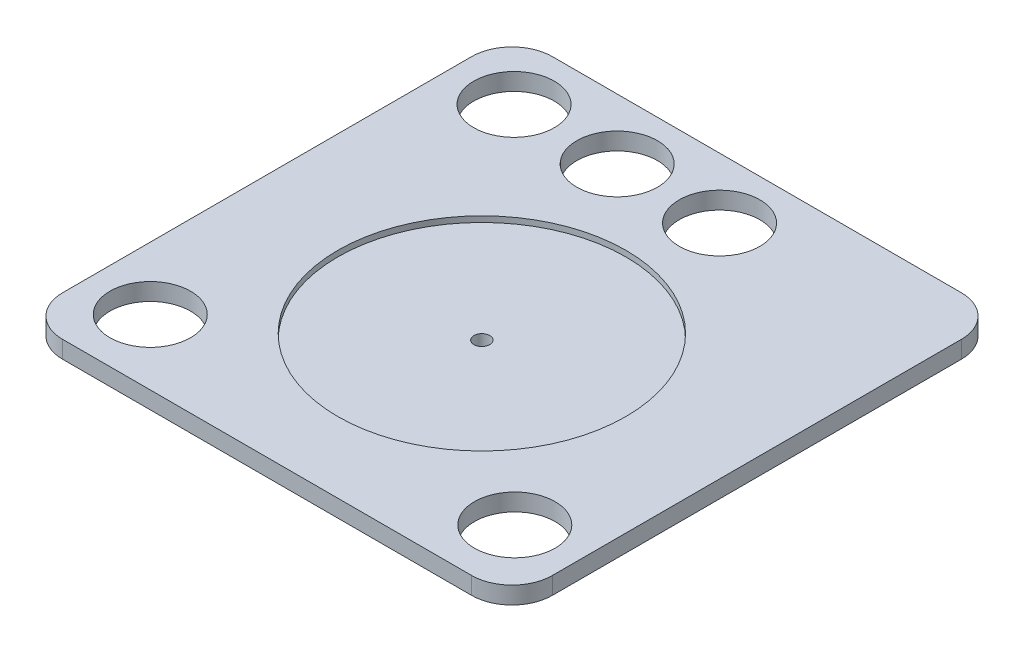
ISO-10303-21;
HEADER;
FILE_DESCRIPTION(('STEP AP214'),'2;1');
FILE_NAME('part.step','',(''),(''),'','','');
FILE_SCHEMA(('AUTOMOTIVE_DESIGN { 1 0 10303 214 1 1 1 1 }'));
ENDSEC;
DATA;
#1=APPLICATION_CONTEXT('core data for automotive mechanical design processes');
#2=APPLICATION_PROTOCOL_DEFINITION('international standard','automotive_design',2000,#1);
#3=PRODUCT_CONTEXT('',#1,'mechanical');
#4=PRODUCT('Part','Part','',(#3));
#5=PRODUCT_RELATED_PRODUCT_CATEGORY('part','',(#4));
#6=PRODUCT_DEFINITION_FORMATION('','',#4);
#7=PRODUCT_DEFINITION_CONTEXT('part definition',#1,'design');
#8=PRODUCT_DEFINITION('design','',#6,#7);
#9=PRODUCT_DEFINITION_SHAPE('','',#8);
#10=(LENGTH_UNIT() NAMED_UNIT(*) SI_UNIT(.MILLI.,.METRE.));
#11=(NAMED_UNIT(*) PLANE_ANGLE_UNIT() SI_UNIT($,.RADIAN.));
#12=(NAMED_UNIT(*) SI_UNIT($,.STERADIAN.) SOLID_ANGLE_UNIT());
#13=UNCERTAINTY_MEASURE_WITH_UNIT(LENGTH_MEASURE(1.E-05),#10,'distance_accuracy_value','');
#14=(GEOMETRIC_REPRESENTATION_CONTEXT(3) GLOBAL_UNCERTAINTY_ASSIGNED_CONTEXT((#13)) GLOBAL_UNIT_ASSIGNED_CONTEXT((#10,
#11,#12)) REPRESENTATION_CONTEXT('',''));
#15=CARTESIAN_POINT('',(0.,0.,0.));
#16=DIRECTION('',(0.,0.,1.));
#17=DIRECTION('',(1.,0.,0.));
#18=AXIS2_PLACEMENT_3D('',#15,#16,#17);
#19=CARTESIAN_POINT('',(2.65313036690087,-3.,-14.80701719));
#20=DIRECTION('',(0.,1.,0.));
#21=DIRECTION('',(0.,0.,1.));
#22=AXIS2_PLACEMENT_3D('',#19,#20,#21);
#23=CYLINDRICAL_SURFACE('',#22,25.);
#24=CARTESIAN_POINT('',(2.65313036690087,0.,-14.80701719));
#25=DIRECTION('',(0.,1.,0.));
#26=DIRECTION('',(0.,0.,1.));
#27=AXIS2_PLACEMENT_3D('',#24,#25,#26);
#28=CIRCLE('',#27,25.);
#29=CARTESIAN_POINT('',(2.65313036690087,0.,10.19298281));
#30=VERTEX_POINT('',#29);
#31=EDGE_CURVE('E136',#30,#30,#28,.T.);
#32=ORIENTED_EDGE('',*,*,#31,.T.);
#33=EDGE_LOOP('',(#32));
#34=FACE_BOUND('',#33,.T.);
#35=CARTESIAN_POINT('',(2.65313036690087,-1.,-14.80701719));
#36=DIRECTION('',(0.,-1.,0.));
#37=DIRECTION('',(0.,0.,-1.));
#38=AXIS2_PLACEMENT_3D('',#35,#36,#37);
#39=CIRCLE('',#38,25.);
#40=CARTESIAN_POINT('',(2.65313036690087,-1.,-39.80701719));
#41=VERTEX_POINT('',#40);
#42=EDGE_CURVE('E11',#41,#41,#39,.F.);
#43=ORIENTED_EDGE('',*,*,#42,.F.);
#44=EDGE_LOOP('',(#43));
#45=FACE_BOUND('',#44,.T.);
#46=ADVANCED_FACE('F33',(#34,#45),#23,.F.);
#47=CARTESIAN_POINT('',(-32.8468696330991,-3.,-55.5385480093677));
#48=DIRECTION('',(0.,1.,0.));
#49=DIRECTION('',(0.,0.,1.));
#50=AXIS2_PLACEMENT_3D('',#47,#48,#49);
#51=CYLINDRICAL_SURFACE('',#50,7.);
#52=CARTESIAN_POINT('',(-32.8468696330991,0.,-55.5385480093677));
#53=DIRECTION('',(0.,1.,0.));
#54=DIRECTION('',(0.,0.,1.));
#55=AXIS2_PLACEMENT_3D('',#52,#53,#54);
#56=CIRCLE('',#55,7.);
#57=CARTESIAN_POINT('',(-32.8468696330991,0.,-62.5385480093677));
#58=VERTEX_POINT('',#57);
#59=CARTESIAN_POINT('',(-39.8468696330991,0.,-55.5385480093677));
#60=VERTEX_POINT('',#59);
#61=EDGE_CURVE('E132',#58,#60,#56,.T.);
#62=ORIENTED_EDGE('',*,*,#61,.F.);
#63=DIRECTION('',(0.,1.,0.));
#64=VECTOR('',#63,1.);
#65=CARTESIAN_POINT('',(-32.8468696330991,-3.,-62.5385480093677));
#66=LINE('',#65,#64);
#67=CARTESIAN_POINT('',(-32.8468696330991,-3.,-62.5385480093677));
#68=VERTEX_POINT('',#67);
#69=EDGE_CURVE('E42',#68,#58,#66,.T.);
#70=ORIENTED_EDGE('',*,*,#69,.F.);
#71=CARTESIAN_POINT('',(-32.8468696330991,-3.,-55.5385480093677));
#72=DIRECTION('',(0.,1.,0.));
#73=DIRECTION('',(0.,0.,1.));
#74=AXIS2_PLACEMENT_3D('',#71,#72,#73);
#75=CIRCLE('',#74,7.);
#76=CARTESIAN_POINT('',(-39.8468696330991,-3.,-55.5385480093677));
#77=VERTEX_POINT('',#76);
#78=EDGE_CURVE('E154',#68,#77,#75,.T.);
#79=ORIENTED_EDGE('',*,*,#78,.T.);
#80=DIRECTION('',(0.,1.,0.));
#81=VECTOR('',#80,1.);
#82=CARTESIAN_POINT('',(-39.8468696330991,-3.,-55.5385480093677));
#83=LINE('',#82,#81);
#84=EDGE_CURVE('E90',#77,#60,#83,.T.);
#85=ORIENTED_EDGE('',*,*,#84,.T.);
#86=EDGE_LOOP('',(#62,#70,#79,#85));
#87=FACE_BOUND('',#86,.T.);
#88=ADVANCED_FACE('F35',(#87),#51,.T.);
#89=CARTESIAN_POINT('',(38.1531303669008,-3.,-62.5385480093677));
#90=DIRECTION('',(0.,0.,-1.));
#91=DIRECTION('',(-1.,0.,0.));
#92=AXIS2_PLACEMENT_3D('',#89,#90,#91);
#93=PLANE('',#92);
#94=DIRECTION('',(-1.,0.,0.));
#95=VECTOR('',#94,1.);
#96=CARTESIAN_POINT('',(38.1531303669008,0.,-62.5385480093677));
#97=LINE('',#96,#95);
#98=CARTESIAN_POINT('',(38.1531303669008,0.,-62.5385480093677));
#99=VERTEX_POINT('',#98);
#100=EDGE_CURVE('E151',#99,#58,#97,.T.);
#101=ORIENTED_EDGE('',*,*,#100,.F.);
#102=DIRECTION('',(0.,1.,0.));
#103=VECTOR('',#102,1.);
#104=CARTESIAN_POINT('',(38.1531303669008,-3.,-62.5385480093677));
#105=LINE('',#104,#103);
#106=CARTESIAN_POINT('',(38.1531303669008,-3.,-62.5385480093677));
#107=VERTEX_POINT('',#106);
#108=EDGE_CURVE('E78',#107,#99,#105,.T.);
#109=ORIENTED_EDGE('',*,*,#108,.F.);
#110=DIRECTION('',(-1.,0.,0.));
#111=VECTOR('',#110,1.);
#112=CARTESIAN_POINT('',(38.1531303669008,-3.,-62.5385480093677));
#113=LINE('',#112,#111);
#114=EDGE_CURVE('E122',#107,#68,#113,.T.);
#115=ORIENTED_EDGE('',*,*,#114,.T.);
#116=ORIENTED_EDGE('',*,*,#69,.T.);
#117=EDGE_LOOP('',(#101,#109,#115,#116));
#118=FACE_BOUND('',#117,.T.);
#119=ADVANCED_FACE('F167',(#118),#93,.T.);
#120=CARTESIAN_POINT('',(38.1531303669009,-3.,-55.5385480093677));
#121=DIRECTION('',(0.,1.,0.));
#122=DIRECTION('',(0.,0.,1.));
#123=AXIS2_PLACEMENT_3D('',#120,#121,#122);
#124=CYLINDRICAL_SURFACE('',#123,7.);
#125=CARTESIAN_POINT('',(38.1531303669009,0.,-55.5385480093677));
#126=DIRECTION('',(0.,1.,0.));
#127=DIRECTION('',(0.,0.,1.));
#128=AXIS2_PLACEMENT_3D('',#125,#126,#127);
#129=CIRCLE('',#128,7.);
#130=CARTESIAN_POINT('',(45.1531303669009,0.,-55.5385480093677));
#131=VERTEX_POINT('',#130);
#132=EDGE_CURVE('E109',#131,#99,#129,.T.);
#133=ORIENTED_EDGE('',*,*,#132,.F.);
#134=DIRECTION('',(0.,1.,0.));
#135=VECTOR('',#134,1.);
#136=CARTESIAN_POINT('',(45.1531303669009,-3.,-55.5385480093677));
#137=LINE('',#136,#135);
#138=CARTESIAN_POINT('',(45.1531303669009,-3.,-55.5385480093677));
#139=VERTEX_POINT('',#138);
#140=EDGE_CURVE('E104',#139,#131,#137,.T.);
#141=ORIENTED_EDGE('',*,*,#140,.F.);
#142=CARTESIAN_POINT('',(38.1531303669009,-3.,-55.5385480093677));
#143=DIRECTION('',(0.,1.,0.));
#144=DIRECTION('',(0.,0.,1.));
#145=AXIS2_PLACEMENT_3D('',#142,#143,#144);
#146=CIRCLE('',#145,7.);
#147=EDGE_CURVE('E107',#139,#107,#146,.T.);
#148=ORIENTED_EDGE('',*,*,#147,.T.);
#149=ORIENTED_EDGE('',*,*,#108,.T.);
#150=EDGE_LOOP('',(#133,#141,#148,#149));
#151=FACE_BOUND('',#150,.T.);
#152=ADVANCED_FACE('F106',(#151),#124,.T.);
#153=CARTESIAN_POINT('',(45.1531303669009,-3.,15.4614519906323));
#154=DIRECTION('',(1.,0.,0.));
#155=DIRECTION('',(0.,0.,-1.));
#156=AXIS2_PLACEMENT_3D('',#153,#154,#155);
#157=PLANE('',#156);
#158=DIRECTION('',(0.,0.,-1.));
#159=VECTOR('',#158,1.);
#160=CARTESIAN_POINT('',(45.1531303669009,0.,15.4614519906323));
#161=LINE('',#160,#159);
#162=CARTESIAN_POINT('',(45.1531303669009,0.,15.4614519906323));
#163=VERTEX_POINT('',#162);
#164=EDGE_CURVE('E148',#163,#131,#161,.T.);
#165=ORIENTED_EDGE('',*,*,#164,.F.);
#166=DIRECTION('',(0.,1.,0.));
#167=VECTOR('',#166,1.);
#168=CARTESIAN_POINT('',(45.1531303669009,-3.,15.4614519906323));
#169=LINE('',#168,#167);
#170=CARTESIAN_POINT('',(45.1531303669009,-3.,15.4614519906323));
#171=VERTEX_POINT('',#170);
#172=EDGE_CURVE('E114',#171,#163,#169,.T.);
#173=ORIENTED_EDGE('',*,*,#172,.F.);
#174=DIRECTION('',(0.,0.,-1.));
#175=VECTOR('',#174,1.);
#176=CARTESIAN_POINT('',(45.1531303669009,-3.,15.4614519906323));
#177=LINE('',#176,#175);
#178=EDGE_CURVE('E120',#171,#139,#177,.T.);
#179=ORIENTED_EDGE('',*,*,#178,.T.);
#180=ORIENTED_EDGE('',*,*,#140,.T.);
#181=EDGE_LOOP('',(#165,#173,#179,#180));
#182=FACE_BOUND('',#181,.T.);
#183=ADVANCED_FACE('F124',(#182),#157,.T.);
#184=CARTESIAN_POINT('',(38.1531303669009,-3.,15.4614519906323));
#185=DIRECTION('',(0.,1.,0.));
#186=DIRECTION('',(0.,0.,1.));
#187=AXIS2_PLACEMENT_3D('',#184,#185,#186);
#188=CYLINDRICAL_SURFACE('',#187,7.);
#189=CARTESIAN_POINT('',(38.1531303669009,0.,15.4614519906323));
#190=DIRECTION('',(0.,1.,0.));
#191=DIRECTION('',(0.,0.,1.));
#192=AXIS2_PLACEMENT_3D('',#189,#190,#191);
#193=CIRCLE('',#192,7.);
#194=CARTESIAN_POINT('',(38.1531303669008,0.,22.4614519906323));
#195=VERTEX_POINT('',#194);
#196=EDGE_CURVE('E145',#195,#163,#193,.T.);
#197=ORIENTED_EDGE('',*,*,#196,.F.);
#198=DIRECTION('',(0.,1.,0.));
#199=VECTOR('',#198,1.);
#200=CARTESIAN_POINT('',(38.1531303669008,-3.,22.4614519906323));
#201=LINE('',#200,#199);
#202=CARTESIAN_POINT('',(38.1531303669008,-3.,22.4614519906323));
#203=VERTEX_POINT('',#202);
#204=EDGE_CURVE('E158',#203,#195,#201,.T.);
#205=ORIENTED_EDGE('',*,*,#204,.F.);
#206=CARTESIAN_POINT('',(38.1531303669009,-3.,15.4614519906323));
#207=DIRECTION('',(0.,1.,0.));
#208=DIRECTION('',(0.,0.,1.));
#209=AXIS2_PLACEMENT_3D('',#206,#207,#208);
#210=CIRCLE('',#209,7.);
#211=EDGE_CURVE('E125',#203,#171,#210,.T.);
#212=ORIENTED_EDGE('',*,*,#211,.T.);
#213=ORIENTED_EDGE('',*,*,#172,.T.);
#214=EDGE_LOOP('',(#197,#205,#212,#213));
#215=FACE_BOUND('',#214,.T.);
#216=ADVANCED_FACE('F238',(#215),#188,.T.);
#217=CARTESIAN_POINT('',(-32.8468696330991,-3.,22.4614519906323));
#218=DIRECTION('',(0.,0.,1.));
#219=DIRECTION('',(1.,0.,0.));
#220=AXIS2_PLACEMENT_3D('',#217,#218,#219);
#221=PLANE('',#220);
#222=DIRECTION('',(1.,0.,0.));
#223=VECTOR('',#222,1.);
#224=CARTESIAN_POINT('',(-32.8468696330991,0.,22.4614519906323));
#225=LINE('',#224,#223);
#226=CARTESIAN_POINT('',(-32.8468696330991,0.,22.4614519906323));
#227=VERTEX_POINT('',#226);
#228=EDGE_CURVE('E142',#227,#195,#225,.T.);
#229=ORIENTED_EDGE('',*,*,#228,.F.);
#230=DIRECTION('',(0.,1.,0.));
#231=VECTOR('',#230,1.);
#232=CARTESIAN_POINT('',(-32.8468696330991,-3.,22.4614519906323));
#233=LINE('',#232,#231);
#234=CARTESIAN_POINT('',(-32.8468696330991,-3.,22.4614519906323));
#235=VERTEX_POINT('',#234);
#236=EDGE_CURVE('E160',#235,#227,#233,.T.);
#237=ORIENTED_EDGE('',*,*,#236,.F.);
#238=DIRECTION('',(1.,0.,0.));
#239=VECTOR('',#238,1.);
#240=CARTESIAN_POINT('',(-32.8468696330991,-3.,22.4614519906323));
#241=LINE('',#240,#239);
#242=EDGE_CURVE('E127',#235,#203,#241,.T.);
#243=ORIENTED_EDGE('',*,*,#242,.T.);
#244=ORIENTED_EDGE('',*,*,#204,.T.);
#245=EDGE_LOOP('',(#229,#237,#243,#244));
#246=FACE_BOUND('',#245,.T.);
#247=ADVANCED_FACE('F232',(#246),#221,.T.);
#248=CARTESIAN_POINT('',(-32.8468696330991,-3.,15.4614519906323));
#249=DIRECTION('',(0.,1.,0.));
#250=DIRECTION('',(0.,0.,1.));
#251=AXIS2_PLACEMENT_3D('',#248,#249,#250);
#252=CYLINDRICAL_SURFACE('',#251,7.);
#253=CARTESIAN_POINT('',(-32.8468696330991,0.,15.4614519906323));
#254=DIRECTION('',(0.,1.,0.));
#255=DIRECTION('',(0.,0.,1.));
#256=AXIS2_PLACEMENT_3D('',#253,#254,#255);
#257=CIRCLE('',#256,7.);
#258=CARTESIAN_POINT('',(-39.8468696330991,0.,15.4614519906323));
#259=VERTEX_POINT('',#258);
#260=EDGE_CURVE('E139',#259,#227,#257,.T.);
#261=ORIENTED_EDGE('',*,*,#260,.F.);
#262=DIRECTION('',(0.,1.,0.));
#263=VECTOR('',#262,1.);
#264=CARTESIAN_POINT('',(-39.8468696330991,-3.,15.4614519906323));
#265=LINE('',#264,#263);
#266=CARTESIAN_POINT('',(-39.8468696330991,-3.,15.4614519906323));
#267=VERTEX_POINT('',#266);
#268=EDGE_CURVE('E162',#267,#259,#265,.T.);
#269=ORIENTED_EDGE('',*,*,#268,.F.);
#270=CARTESIAN_POINT('',(-32.8468696330991,-3.,15.4614519906323));
#271=DIRECTION('',(0.,1.,0.));
#272=DIRECTION('',(0.,0.,1.));
#273=AXIS2_PLACEMENT_3D('',#270,#271,#272);
#274=CIRCLE('',#273,7.);
#275=EDGE_CURVE('E226',#267,#235,#274,.T.);
#276=ORIENTED_EDGE('',*,*,#275,.T.);
#277=ORIENTED_EDGE('',*,*,#236,.T.);
#278=EDGE_LOOP('',(#261,#269,#276,#277));
#279=FACE_BOUND('',#278,.T.);
#280=ADVANCED_FACE('F236',(#279),#252,.T.);
#281=CARTESIAN_POINT('',(-39.8468696330991,-3.,-55.5385480093677));
#282=DIRECTION('',(-1.,0.,0.));
#283=DIRECTION('',(0.,0.,1.));
#284=AXIS2_PLACEMENT_3D('',#281,#282,#283);
#285=PLANE('',#284);
#286=DIRECTION('',(0.,0.,1.));
#287=VECTOR('',#286,1.);
#288=CARTESIAN_POINT('',(-39.8468696330991,0.,-55.5385480093677));
#289=LINE('',#288,#287);
#290=EDGE_CURVE('E135',#60,#259,#289,.T.);
#291=ORIENTED_EDGE('',*,*,#290,.F.);
#292=ORIENTED_EDGE('',*,*,#84,.F.);
#293=DIRECTION('',(0.,0.,1.));
#294=VECTOR('',#293,1.);
#295=CARTESIAN_POINT('',(-39.8468696330991,-3.,-55.5385480093677));
#296=LINE('',#295,#294);
#297=EDGE_CURVE('E224',#77,#267,#296,.T.);
#298=ORIENTED_EDGE('',*,*,#297,.T.);
#299=ORIENTED_EDGE('',*,*,#268,.T.);
#300=EDGE_LOOP('',(#291,#292,#298,#299));
#301=FACE_BOUND('',#300,.T.);
#302=ADVANCED_FACE('F163',(#301),#285,.T.);
#303=CARTESIAN_POINT('',(-32.8468696330991,-3.,-55.5385480093677));
#304=DIRECTION('',(0.,1.,0.));
#305=DIRECTION('',(0.,0.,1.));
#306=AXIS2_PLACEMENT_3D('',#303,#304,#305);
#307=PLANE('',#306);
#308=CARTESIAN_POINT('',(2.65313036690087,-3.,-14.80701719));
#309=DIRECTION('',(0.,1.,0.));
#310=DIRECTION('',(0.,0.,1.));
#311=AXIS2_PLACEMENT_3D('',#308,#309,#310);
#312=CIRCLE('',#311,1.375);
#313=CARTESIAN_POINT('',(2.65313036690087,-3.,-13.43201719));
#314=VERTEX_POINT('',#313);
#315=EDGE_CURVE('E321',#314,#314,#312,.T.);
#316=ORIENTED_EDGE('',*,*,#315,.T.);
#317=EDGE_LOOP('',(#316));
#318=FACE_BOUND('',#317,.T.);
#319=CARTESIAN_POINT('',(34.2916398374492,-3.,11.1179624269692));
#320=DIRECTION('',(0.,1.,0.));
#321=DIRECTION('',(0.,0.,1.));
#322=AXIS2_PLACEMENT_3D('',#319,#320,#321);
#323=CIRCLE('',#322,7.);
#324=CARTESIAN_POINT('',(34.2916398374492,-3.,18.1179624269692));
#325=VERTEX_POINT('',#324);
#326=EDGE_CURVE('E317',#325,#325,#323,.T.);
#327=ORIENTED_EDGE('',*,*,#326,.T.);
#328=EDGE_LOOP('',(#327));
#329=FACE_BOUND('',#328,.T.);
#330=CARTESIAN_POINT('',(-28.97725989,-3.,11.1179624269692));
#331=DIRECTION('',(0.,1.,0.));
#332=DIRECTION('',(0.,0.,1.));
#333=AXIS2_PLACEMENT_3D('',#330,#331,#332);
#334=CIRCLE('',#333,7.);
#335=CARTESIAN_POINT('',(-28.97725989,-3.,18.1179624269692));
#336=VERTEX_POINT('',#335);
#337=EDGE_CURVE('E314',#336,#336,#334,.T.);
#338=ORIENTED_EDGE('',*,*,#337,.T.);
#339=EDGE_LOOP('',(#338));
#340=FACE_BOUND('',#339,.T.);
#341=CARTESIAN_POINT('',(6.69252819,-3.,-52.02421358));
#342=DIRECTION('',(0.,1.,0.));
#343=DIRECTION('',(0.,0.,1.));
#344=AXIS2_PLACEMENT_3D('',#341,#342,#343);
#345=CIRCLE('',#344,7.);
#346=CARTESIAN_POINT('',(6.69252819,-3.,-45.02421358));
#347=VERTEX_POINT('',#346);
#348=EDGE_CURVE('E308',#347,#347,#345,.T.);
#349=ORIENTED_EDGE('',*,*,#348,.T.);
#350=EDGE_LOOP('',(#349));
#351=FACE_BOUND('',#350,.T.);
#352=CARTESIAN_POINT('',(-11.0833153180513,-3.,-52.02421358));
#353=DIRECTION('',(0.,1.,0.));
#354=DIRECTION('',(0.,0.,1.));
#355=AXIS2_PLACEMENT_3D('',#352,#353,#354);
#356=CIRCLE('',#355,7.);
#357=CARTESIAN_POINT('',(-11.0833153180513,-3.,-45.02421358));
#358=VERTEX_POINT('',#357);
#359=EDGE_CURVE('E307',#358,#358,#356,.T.);
#360=ORIENTED_EDGE('',*,*,#359,.T.);
#361=EDGE_LOOP('',(#360));
#362=FACE_BOUND('',#361,.T.);
#363=CARTESIAN_POINT('',(-28.97725989,-3.,-52.02421358));
#364=DIRECTION('',(0.,1.,0.));
#365=DIRECTION('',(0.,0.,1.));
#366=AXIS2_PLACEMENT_3D('',#363,#364,#365);
#367=CIRCLE('',#366,7.);
#368=CARTESIAN_POINT('',(-28.97725989,-3.,-45.02421358));
#369=VERTEX_POINT('',#368);
#370=EDGE_CURVE('E217',#369,#369,#367,.T.);
#371=ORIENTED_EDGE('',*,*,#370,.T.);
#372=EDGE_LOOP('',(#371));
#373=FACE_BOUND('',#372,.T.);
#374=ORIENTED_EDGE('',*,*,#78,.F.);
#375=ORIENTED_EDGE('',*,*,#114,.F.);
#376=ORIENTED_EDGE('',*,*,#147,.F.);
#377=ORIENTED_EDGE('',*,*,#178,.F.);
#378=ORIENTED_EDGE('',*,*,#211,.F.);
#379=ORIENTED_EDGE('',*,*,#242,.F.);
#380=ORIENTED_EDGE('',*,*,#275,.F.);
#381=ORIENTED_EDGE('',*,*,#297,.F.);
#382=EDGE_LOOP('',(#374,#375,#376,#377,#378,#379,#380,#381));
#383=FACE_BOUND('',#382,.T.);
#384=ADVANCED_FACE('F118',(#318,#329,#340,#351,#362,#373,#383),#307,.F.);
#385=CARTESIAN_POINT('',(-32.8468696330991,0.,-55.5385480093677));
#386=DIRECTION('',(0.,1.,0.));
#387=DIRECTION('',(0.,0.,1.));
#388=AXIS2_PLACEMENT_3D('',#385,#386,#387);
#389=PLANE('',#388);
#390=CARTESIAN_POINT('',(34.2916398374492,0.,11.1179624269692));
#391=DIRECTION('',(0.,1.,0.));
#392=DIRECTION('',(0.,0.,1.));
#393=AXIS2_PLACEMENT_3D('',#390,#391,#392);
#394=CIRCLE('',#393,7.);
#395=CARTESIAN_POINT('',(34.2916398374492,0.,18.1179624269692));
#396=VERTEX_POINT('',#395);
#397=EDGE_CURVE('E199',#396,#396,#394,.T.);
#398=ORIENTED_EDGE('',*,*,#397,.F.);
#399=EDGE_LOOP('',(#398));
#400=FACE_BOUND('',#399,.T.);
#401=CARTESIAN_POINT('',(-28.97725989,0.,11.1179624269692));
#402=DIRECTION('',(0.,1.,0.));
#403=DIRECTION('',(0.,0.,1.));
#404=AXIS2_PLACEMENT_3D('',#401,#402,#403);
#405=CIRCLE('',#404,7.);
#406=CARTESIAN_POINT('',(-28.97725989,0.,18.1179624269692));
#407=VERTEX_POINT('',#406);
#408=EDGE_CURVE('E203',#407,#407,#405,.T.);
#409=ORIENTED_EDGE('',*,*,#408,.F.);
#410=EDGE_LOOP('',(#409));
#411=FACE_BOUND('',#410,.T.);
#412=CARTESIAN_POINT('',(6.69252819,0.,-52.02421358));
#413=DIRECTION('',(0.,1.,0.));
#414=DIRECTION('',(0.,0.,1.));
#415=AXIS2_PLACEMENT_3D('',#412,#413,#414);
#416=CIRCLE('',#415,7.);
#417=CARTESIAN_POINT('',(6.69252819,0.,-45.02421358));
#418=VERTEX_POINT('',#417);
#419=EDGE_CURVE('E207',#418,#418,#416,.T.);
#420=ORIENTED_EDGE('',*,*,#419,.F.);
#421=EDGE_LOOP('',(#420));
#422=FACE_BOUND('',#421,.T.);
#423=CARTESIAN_POINT('',(-11.0833153180513,0.,-52.02421358));
#424=DIRECTION('',(0.,1.,0.));
#425=DIRECTION('',(0.,0.,1.));
#426=AXIS2_PLACEMENT_3D('',#423,#424,#425);
#427=CIRCLE('',#426,7.);
#428=CARTESIAN_POINT('',(-11.0833153180513,0.,-45.02421358));
#429=VERTEX_POINT('',#428);
#430=EDGE_CURVE('E211',#429,#429,#427,.T.);
#431=ORIENTED_EDGE('',*,*,#430,.F.);
#432=EDGE_LOOP('',(#431));
#433=FACE_BOUND('',#432,.T.);
#434=CARTESIAN_POINT('',(-28.97725989,0.,-52.02421358));
#435=DIRECTION('',(0.,1.,0.));
#436=DIRECTION('',(0.,0.,1.));
#437=AXIS2_PLACEMENT_3D('',#434,#435,#436);
#438=CIRCLE('',#437,7.);
#439=CARTESIAN_POINT('',(-28.97725989,0.,-45.02421358));
#440=VERTEX_POINT('',#439);
#441=EDGE_CURVE('E215',#440,#440,#438,.T.);
#442=ORIENTED_EDGE('',*,*,#441,.F.);
#443=EDGE_LOOP('',(#442));
#444=FACE_BOUND('',#443,.T.);
#445=ORIENTED_EDGE('',*,*,#31,.F.);
#446=EDGE_LOOP('',(#445));
#447=FACE_BOUND('',#446,.T.);
#448=ORIENTED_EDGE('',*,*,#61,.T.);
#449=ORIENTED_EDGE('',*,*,#290,.T.);
#450=ORIENTED_EDGE('',*,*,#260,.T.);
#451=ORIENTED_EDGE('',*,*,#228,.T.);
#452=ORIENTED_EDGE('',*,*,#196,.T.);
#453=ORIENTED_EDGE('',*,*,#164,.T.);
#454=ORIENTED_EDGE('',*,*,#132,.T.);
#455=ORIENTED_EDGE('',*,*,#100,.T.);
#456=EDGE_LOOP('',(#448,#449,#450,#451,#452,#453,#454,#455));
#457=FACE_BOUND('',#456,.T.);
#458=ADVANCED_FACE('F166',(#400,#411,#422,#433,#444,#447,#457),#389,.T.);
#459=CARTESIAN_POINT('',(-28.97725989,-3.,-52.02421358));
#460=DIRECTION('',(0.,1.,0.));
#461=DIRECTION('',(0.,0.,1.));
#462=AXIS2_PLACEMENT_3D('',#459,#460,#461);
#463=CYLINDRICAL_SURFACE('',#462,7.);
#464=ORIENTED_EDGE('',*,*,#370,.F.);
#465=EDGE_LOOP('',(#464));
#466=FACE_BOUND('',#465,.T.);
#467=ORIENTED_EDGE('',*,*,#441,.T.);
#468=EDGE_LOOP('',(#467));
#469=FACE_BOUND('',#468,.T.);
#470=ADVANCED_FACE('F185',(#466,#469),#463,.F.);
#471=CARTESIAN_POINT('',(-11.0833153180513,-3.,-52.02421358));
#472=DIRECTION('',(0.,1.,0.));
#473=DIRECTION('',(0.,0.,1.));
#474=AXIS2_PLACEMENT_3D('',#471,#472,#473);
#475=CYLINDRICAL_SURFACE('',#474,7.);
#476=ORIENTED_EDGE('',*,*,#359,.F.);
#477=EDGE_LOOP('',(#476));
#478=FACE_BOUND('',#477,.T.);
#479=ORIENTED_EDGE('',*,*,#430,.T.);
#480=EDGE_LOOP('',(#479));
#481=FACE_BOUND('',#480,.T.);
#482=ADVANCED_FACE('F194',(#478,#481),#475,.F.);
#483=CARTESIAN_POINT('',(6.69252819,-3.,-52.02421358));
#484=DIRECTION('',(0.,1.,0.));
#485=DIRECTION('',(0.,0.,1.));
#486=AXIS2_PLACEMENT_3D('',#483,#484,#485);
#487=CYLINDRICAL_SURFACE('',#486,7.);
#488=ORIENTED_EDGE('',*,*,#348,.F.);
#489=EDGE_LOOP('',(#488));
#490=FACE_BOUND('',#489,.T.);
#491=ORIENTED_EDGE('',*,*,#419,.T.);
#492=EDGE_LOOP('',(#491));
#493=FACE_BOUND('',#492,.T.);
#494=ADVANCED_FACE('F296',(#490,#493),#487,.F.);
#495=CARTESIAN_POINT('',(-28.97725989,-3.,11.1179624269692));
#496=DIRECTION('',(0.,1.,0.));
#497=DIRECTION('',(0.,0.,1.));
#498=AXIS2_PLACEMENT_3D('',#495,#496,#497);
#499=CYLINDRICAL_SURFACE('',#498,7.);
#500=ORIENTED_EDGE('',*,*,#337,.F.);
#501=EDGE_LOOP('',(#500));
#502=FACE_BOUND('',#501,.T.);
#503=ORIENTED_EDGE('',*,*,#408,.T.);
#504=EDGE_LOOP('',(#503));
#505=FACE_BOUND('',#504,.T.);
#506=ADVANCED_FACE('F292',(#502,#505),#499,.F.);
#507=CARTESIAN_POINT('',(34.2916398374492,-3.,11.1179624269692));
#508=DIRECTION('',(0.,1.,0.));
#509=DIRECTION('',(0.,0.,1.));
#510=AXIS2_PLACEMENT_3D('',#507,#508,#509);
#511=CYLINDRICAL_SURFACE('',#510,7.);
#512=ORIENTED_EDGE('',*,*,#326,.F.);
#513=EDGE_LOOP('',(#512));
#514=FACE_BOUND('',#513,.T.);
#515=ORIENTED_EDGE('',*,*,#397,.T.);
#516=EDGE_LOOP('',(#515));
#517=FACE_BOUND('',#516,.T.);
#518=ADVANCED_FACE('F273',(#514,#517),#511,.F.);
#519=CARTESIAN_POINT('',(2.65313036690087,-1.,-14.80701719));
#520=DIRECTION('',(0.,-1.,0.));
#521=DIRECTION('',(0.,0.,-1.));
#522=AXIS2_PLACEMENT_3D('',#519,#520,#521);
#523=PLANE('',#522);
#524=CARTESIAN_POINT('',(2.65313036690087,-1.,-14.80701719));
#525=DIRECTION('',(0.,1.,0.));
#526=DIRECTION('',(0.,0.,1.));
#527=AXIS2_PLACEMENT_3D('',#524,#525,#526);
#528=CIRCLE('',#527,1.375);
#529=CARTESIAN_POINT('',(2.65313036690087,-1.,-13.43201719));
#530=VERTEX_POINT('',#529);
#531=EDGE_CURVE('E324',#530,#530,#528,.T.);
#532=ORIENTED_EDGE('',*,*,#531,.F.);
#533=EDGE_LOOP('',(#532));
#534=FACE_BOUND('',#533,.T.);
#535=ORIENTED_EDGE('',*,*,#42,.T.);
#536=EDGE_LOOP('',(#535));
#537=FACE_BOUND('',#536,.T.);
#538=ADVANCED_FACE('F268',(#534,#537),#523,.F.);
#539=CARTESIAN_POINT('',(2.65313036690087,-3.,-14.80701719));
#540=DIRECTION('',(0.,1.,0.));
#541=DIRECTION('',(0.,0.,1.));
#542=AXIS2_PLACEMENT_3D('',#539,#540,#541);
#543=CYLINDRICAL_SURFACE('',#542,1.375);
#544=ORIENTED_EDGE('',*,*,#315,.F.);
#545=EDGE_LOOP('',(#544));
#546=FACE_BOUND('',#545,.T.);
#547=ORIENTED_EDGE('',*,*,#531,.T.);
#548=EDGE_LOOP('',(#547));
#549=FACE_BOUND('',#548,.T.);
#550=ADVANCED_FACE('F272',(#546,#549),#543,.F.);
#551=CLOSED_SHELL('',(#46,#88,#119,#152,#183,#216,#247,#280,#302,#384,#458,#470,#482,#494,#506,
#518,#538,#550));
#552=MANIFOLD_SOLID_BREP('B2',#551);
#553=ADVANCED_BREP_SHAPE_REPRESENTATION('',(#18,#552),#14);
#554=SHAPE_DEFINITION_REPRESENTATION(#9,#553);
ENDSEC;
END-ISO-10303-21;
